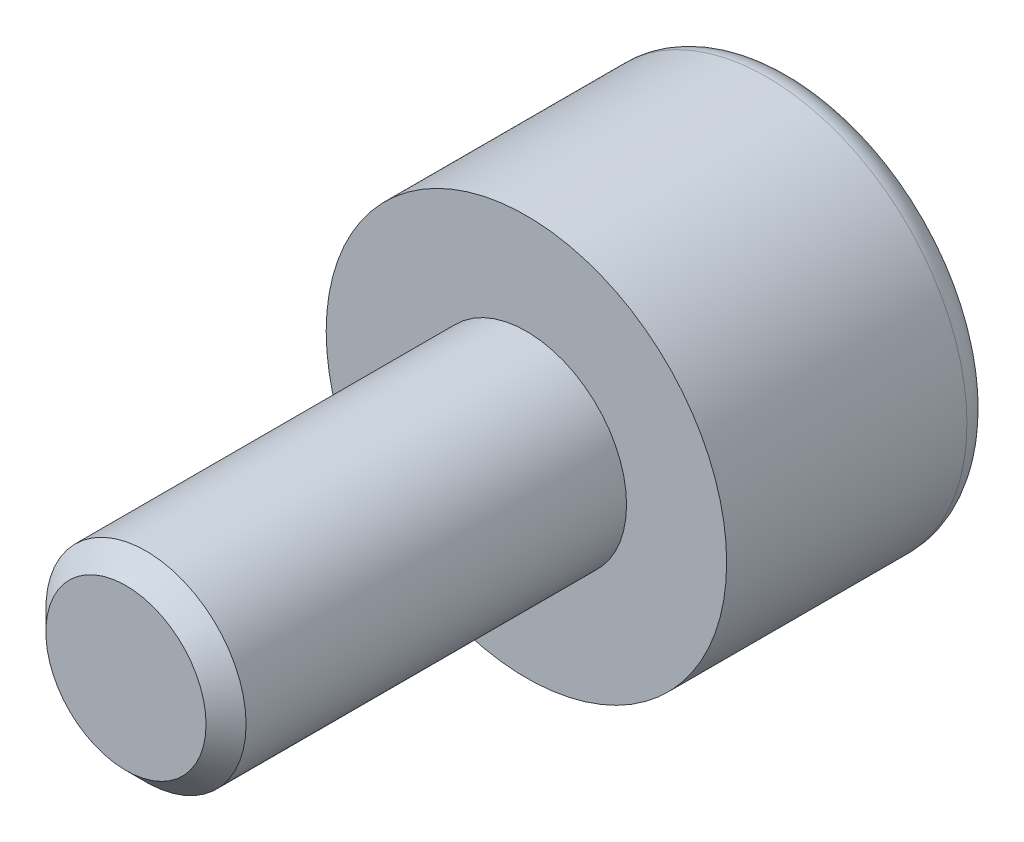
ISO-10303-21;
HEADER;
FILE_DESCRIPTION(('STEP AP214'),'2;1');
FILE_NAME('part.step','',(''),(''),'','','');
FILE_SCHEMA(('AUTOMOTIVE_DESIGN { 1 0 10303 214 1 1 1 1 }'));
ENDSEC;
DATA;
#1=APPLICATION_CONTEXT('core data for automotive mechanical design processes');
#2=APPLICATION_PROTOCOL_DEFINITION('international standard','automotive_design',2000,#1);
#3=PRODUCT_CONTEXT('',#1,'mechanical');
#4=PRODUCT('Part','Part','',(#3));
#5=PRODUCT_RELATED_PRODUCT_CATEGORY('part','',(#4));
#6=PRODUCT_DEFINITION_FORMATION('','',#4);
#7=PRODUCT_DEFINITION_CONTEXT('part definition',#1,'design');
#8=PRODUCT_DEFINITION('design','',#6,#7);
#9=PRODUCT_DEFINITION_SHAPE('','',#8);
#10=(LENGTH_UNIT() NAMED_UNIT(*) SI_UNIT(.MILLI.,.METRE.));
#11=(NAMED_UNIT(*) PLANE_ANGLE_UNIT() SI_UNIT($,.RADIAN.));
#12=(NAMED_UNIT(*) SI_UNIT($,.STERADIAN.) SOLID_ANGLE_UNIT());
#13=UNCERTAINTY_MEASURE_WITH_UNIT(LENGTH_MEASURE(1.E-05),#10,'distance_accuracy_value','');
#14=(GEOMETRIC_REPRESENTATION_CONTEXT(3) GLOBAL_UNCERTAINTY_ASSIGNED_CONTEXT((#13)) GLOBAL_UNIT_ASSIGNED_CONTEXT((#10,
#11,#12)) REPRESENTATION_CONTEXT('',''));
#15=CARTESIAN_POINT('',(0.,0.,0.));
#16=DIRECTION('',(0.,0.,1.));
#17=DIRECTION('',(1.,0.,0.));
#18=AXIS2_PLACEMENT_3D('',#15,#16,#17);
#19=CARTESIAN_POINT('',(0.,0.,-4.));
#20=DIRECTION('',(0.,0.,1.));
#21=DIRECTION('',(1.,0.,0.));
#22=AXIS2_PLACEMENT_3D('',#19,#20,#21);
#23=PLANE('',#22);
#24=CARTESIAN_POINT('',(0.,0.,-4.));
#25=DIRECTION('',(0.,0.,-1.));
#26=DIRECTION('',(-1.,0.,0.));
#27=AXIS2_PLACEMENT_3D('',#24,#25,#26);
#28=CIRCLE('',#27,2.6);
#29=CARTESIAN_POINT('',(-2.6,0.,-4.));
#30=VERTEX_POINT('',#29);
#31=EDGE_CURVE('E149',#30,#30,#28,.T.);
#32=ORIENTED_EDGE('',*,*,#31,.T.);
#33=EDGE_LOOP('',(#32));
#34=FACE_BOUND('',#33,.T.);
#35=DIRECTION('',(-0.86602540378444,0.499999999999998,0.));
#36=VECTOR('',#35,1.);
#37=CARTESIAN_POINT('',(0.,1.73205080756888,-4.));
#38=LINE('',#37,#36);
#39=CARTESIAN_POINT('',(1.5,0.866025403784442,-4.));
#40=VERTEX_POINT('',#39);
#41=CARTESIAN_POINT('',(0.,1.73205080756888,-4.));
#42=VERTEX_POINT('',#41);
#43=EDGE_CURVE('E51',#40,#42,#38,.T.);
#44=ORIENTED_EDGE('',*,*,#43,.T.);
#45=DIRECTION('',(-0.866025403784438,-0.500000000000001,0.));
#46=VECTOR('',#45,1.);
#47=CARTESIAN_POINT('',(0.,1.73205080756888,-4.));
#48=LINE('',#47,#46);
#49=CARTESIAN_POINT('',(-1.5,0.866025403784441,-4.));
#50=VERTEX_POINT('',#49);
#51=EDGE_CURVE('E122',#42,#50,#48,.T.);
#52=ORIENTED_EDGE('',*,*,#51,.T.);
#53=DIRECTION('',(0.,-1.,0.));
#54=VECTOR('',#53,1.);
#55=CARTESIAN_POINT('',(-1.5,-0.866025403784441,-4.));
#56=LINE('',#55,#54);
#57=CARTESIAN_POINT('',(-1.5,-0.866025403784441,-4.));
#58=VERTEX_POINT('',#57);
#59=EDGE_CURVE('E126',#50,#58,#56,.T.);
#60=ORIENTED_EDGE('',*,*,#59,.T.);
#61=DIRECTION('',(0.866025403784438,-0.500000000000001,0.));
#62=VECTOR('',#61,1.);
#63=CARTESIAN_POINT('',(0.,-1.73205080756888,-4.));
#64=LINE('',#63,#62);
#65=CARTESIAN_POINT('',(0.,-1.73205080756888,-4.));
#66=VERTEX_POINT('',#65);
#67=EDGE_CURVE('E129',#58,#66,#64,.T.);
#68=ORIENTED_EDGE('',*,*,#67,.T.);
#69=DIRECTION('',(0.86602540378444,0.499999999999998,0.));
#70=VECTOR('',#69,1.);
#71=CARTESIAN_POINT('',(0.,-1.73205080756888,-4.));
#72=LINE('',#71,#70);
#73=CARTESIAN_POINT('',(1.5,-0.866025403784441,-4.));
#74=VERTEX_POINT('',#73);
#75=EDGE_CURVE('E112',#66,#74,#72,.T.);
#76=ORIENTED_EDGE('',*,*,#75,.T.);
#77=DIRECTION('',(0.,1.,0.));
#78=VECTOR('',#77,1.);
#79=CARTESIAN_POINT('',(1.5,-0.866025403784441,-4.));
#80=LINE('',#79,#78);
#81=EDGE_CURVE('E132',#74,#40,#80,.T.);
#82=ORIENTED_EDGE('',*,*,#81,.T.);
#83=EDGE_LOOP('',(#44,#52,#60,#68,#76,#82));
#84=FACE_BOUND('',#83,.T.);
#85=ADVANCED_FACE('F36',(#34,#84),#23,.F.);
#86=CARTESIAN_POINT('',(0.,0.,-3.6));
#87=DIRECTION('',(0.,0.,-1.));
#88=DIRECTION('',(-1.,0.,0.));
#89=AXIS2_PLACEMENT_3D('',#86,#87,#88);
#90=TOROIDAL_SURFACE('',#89,2.6,0.4);
#91=ORIENTED_EDGE('',*,*,#31,.F.);
#92=EDGE_LOOP('',(#91));
#93=FACE_BOUND('',#92,.T.);
#94=CARTESIAN_POINT('',(0.,0.,-3.6));
#95=DIRECTION('',(0.,0.,-1.));
#96=DIRECTION('',(-1.,0.,0.));
#97=AXIS2_PLACEMENT_3D('',#94,#95,#96);
#98=CIRCLE('',#97,3.);
#99=CARTESIAN_POINT('',(-3.,0.,-3.6));
#100=VERTEX_POINT('',#99);
#101=EDGE_CURVE('E146',#100,#100,#98,.T.);
#102=ORIENTED_EDGE('',*,*,#101,.T.);
#103=EDGE_LOOP('',(#102));
#104=FACE_BOUND('',#103,.T.);
#105=ADVANCED_FACE('F166',(#93,#104),#90,.T.);
#106=CARTESIAN_POINT('',(0.,0.,0.));
#107=DIRECTION('',(0.,0.,-1.));
#108=DIRECTION('',(-1.,0.,0.));
#109=AXIS2_PLACEMENT_3D('',#106,#107,#108);
#110=CYLINDRICAL_SURFACE('',#109,3.);
#111=ORIENTED_EDGE('',*,*,#101,.F.);
#112=EDGE_LOOP('',(#111));
#113=FACE_BOUND('',#112,.T.);
#114=CARTESIAN_POINT('',(0.,0.,0.));
#115=DIRECTION('',(0.,0.,-1.));
#116=DIRECTION('',(-1.,0.,0.));
#117=AXIS2_PLACEMENT_3D('',#114,#115,#116);
#118=CIRCLE('',#117,3.);
#119=CARTESIAN_POINT('',(-3.,0.,0.));
#120=VERTEX_POINT('',#119);
#121=EDGE_CURVE('E143',#120,#120,#118,.T.);
#122=ORIENTED_EDGE('',*,*,#121,.T.);
#123=EDGE_LOOP('',(#122));
#124=FACE_BOUND('',#123,.T.);
#125=ADVANCED_FACE('F171',(#113,#124),#110,.T.);
#126=CARTESIAN_POINT('',(0.,0.,0.));
#127=DIRECTION('',(0.,0.,-1.));
#128=DIRECTION('',(-1.,0.,0.));
#129=AXIS2_PLACEMENT_3D('',#126,#127,#128);
#130=PLANE('',#129);
#131=CARTESIAN_POINT('',(0.,0.,0.));
#132=DIRECTION('',(0.,0.,1.));
#133=DIRECTION('',(1.,0.,0.));
#134=AXIS2_PLACEMENT_3D('',#131,#132,#133);
#135=CIRCLE('',#134,1.5);
#136=CARTESIAN_POINT('',(1.5,0.,0.));
#137=VERTEX_POINT('',#136);
#138=EDGE_CURVE('E123',#137,#137,#135,.T.);
#139=ORIENTED_EDGE('',*,*,#138,.F.);
#140=EDGE_LOOP('',(#139));
#141=FACE_BOUND('',#140,.T.);
#142=ORIENTED_EDGE('',*,*,#121,.F.);
#143=EDGE_LOOP('',(#142));
#144=FACE_BOUND('',#143,.T.);
#145=ADVANCED_FACE('F178',(#141,#144),#130,.F.);
#146=CARTESIAN_POINT('',(0.,1.73205080756888,-2.));
#147=DIRECTION('',(-0.499999999999998,-0.86602540378444,0.));
#148=DIRECTION('',(0.86602540378444,-0.499999999999998,0.));
#149=AXIS2_PLACEMENT_3D('',#146,#147,#148);
#150=PLANE('',#149);
#151=ORIENTED_EDGE('',*,*,#43,.F.);
#152=DIRECTION('',(0.,0.,-1.));
#153=VECTOR('',#152,1.);
#154=CARTESIAN_POINT('',(1.5,0.866025403784442,-2.));
#155=LINE('',#154,#153);
#156=CARTESIAN_POINT('',(1.5,0.866025403784442,-2.));
#157=VERTEX_POINT('',#156);
#158=EDGE_CURVE('E117',#157,#40,#155,.T.);
#159=ORIENTED_EDGE('',*,*,#158,.F.);
#160=DIRECTION('',(-0.86602540378444,0.499999999999998,0.));
#161=VECTOR('',#160,1.);
#162=CARTESIAN_POINT('',(0.,1.73205080756888,-2.));
#163=LINE('',#162,#161);
#164=CARTESIAN_POINT('',(0.,1.73205080756888,-2.));
#165=VERTEX_POINT('',#164);
#166=EDGE_CURVE('E135',#157,#165,#163,.T.);
#167=ORIENTED_EDGE('',*,*,#166,.T.);
#168=DIRECTION('',(0.,0.,-1.));
#169=VECTOR('',#168,1.);
#170=CARTESIAN_POINT('',(0.,1.73205080756888,-2.));
#171=LINE('',#170,#169);
#172=EDGE_CURVE('E141',#165,#42,#171,.T.);
#173=ORIENTED_EDGE('',*,*,#172,.T.);
#174=EDGE_LOOP('',(#151,#159,#167,#173));
#175=FACE_BOUND('',#174,.T.);
#176=ADVANCED_FACE('F182',(#175),#150,.T.);
#177=CARTESIAN_POINT('',(0.,1.73205080756888,-2.));
#178=DIRECTION('',(0.500000000000001,-0.866025403784438,0.));
#179=DIRECTION('',(0.866025403784438,0.500000000000001,0.));
#180=AXIS2_PLACEMENT_3D('',#177,#178,#179);
#181=PLANE('',#180);
#182=ORIENTED_EDGE('',*,*,#51,.F.);
#183=ORIENTED_EDGE('',*,*,#172,.F.);
#184=DIRECTION('',(-0.866025403784438,-0.500000000000001,0.));
#185=VECTOR('',#184,1.);
#186=CARTESIAN_POINT('',(0.,1.73205080756888,-2.));
#187=LINE('',#186,#185);
#188=CARTESIAN_POINT('',(-1.5,0.866025403784441,-2.));
#189=VERTEX_POINT('',#188);
#190=EDGE_CURVE('E90',#165,#189,#187,.T.);
#191=ORIENTED_EDGE('',*,*,#190,.T.);
#192=DIRECTION('',(0.,0.,-1.));
#193=VECTOR('',#192,1.);
#194=CARTESIAN_POINT('',(-1.5,0.866025403784441,-2.));
#195=LINE('',#194,#193);
#196=EDGE_CURVE('E139',#189,#50,#195,.T.);
#197=ORIENTED_EDGE('',*,*,#196,.T.);
#198=EDGE_LOOP('',(#182,#183,#191,#197));
#199=FACE_BOUND('',#198,.T.);
#200=ADVANCED_FACE('F186',(#199),#181,.T.);
#201=CARTESIAN_POINT('',(-1.5,-0.866025403784441,-2.));
#202=DIRECTION('',(1.,0.,0.));
#203=DIRECTION('',(0.,0.,-1.));
#204=AXIS2_PLACEMENT_3D('',#201,#202,#203);
#205=PLANE('',#204);
#206=ORIENTED_EDGE('',*,*,#59,.F.);
#207=ORIENTED_EDGE('',*,*,#196,.F.);
#208=DIRECTION('',(0.,-1.,0.));
#209=VECTOR('',#208,1.);
#210=CARTESIAN_POINT('',(-1.5,-0.866025403784441,-2.));
#211=LINE('',#210,#209);
#212=CARTESIAN_POINT('',(-1.5,-0.866025403784441,-2.));
#213=VERTEX_POINT('',#212);
#214=EDGE_CURVE('E108',#189,#213,#211,.T.);
#215=ORIENTED_EDGE('',*,*,#214,.T.);
#216=DIRECTION('',(0.,0.,-1.));
#217=VECTOR('',#216,1.);
#218=CARTESIAN_POINT('',(-1.5,-0.866025403784441,-2.));
#219=LINE('',#218,#217);
#220=EDGE_CURVE('E105',#213,#58,#219,.T.);
#221=ORIENTED_EDGE('',*,*,#220,.T.);
#222=EDGE_LOOP('',(#206,#207,#215,#221));
#223=FACE_BOUND('',#222,.T.);
#224=ADVANCED_FACE('F189',(#223),#205,.T.);
#225=CARTESIAN_POINT('',(0.,-1.73205080756888,-2.));
#226=DIRECTION('',(0.500000000000001,0.866025403784438,0.));
#227=DIRECTION('',(-0.866025403784438,0.500000000000001,0.));
#228=AXIS2_PLACEMENT_3D('',#225,#226,#227);
#229=PLANE('',#228);
#230=ORIENTED_EDGE('',*,*,#67,.F.);
#231=ORIENTED_EDGE('',*,*,#220,.F.);
#232=DIRECTION('',(0.866025403784438,-0.500000000000001,0.));
#233=VECTOR('',#232,1.);
#234=CARTESIAN_POINT('',(0.,-1.73205080756888,-2.));
#235=LINE('',#234,#233);
#236=CARTESIAN_POINT('',(0.,-1.73205080756888,-2.));
#237=VERTEX_POINT('',#236);
#238=EDGE_CURVE('E100',#213,#237,#235,.T.);
#239=ORIENTED_EDGE('',*,*,#238,.T.);
#240=DIRECTION('',(0.,0.,-1.));
#241=VECTOR('',#240,1.);
#242=CARTESIAN_POINT('',(0.,-1.73205080756888,-2.));
#243=LINE('',#242,#241);
#244=EDGE_CURVE('E104',#237,#66,#243,.T.);
#245=ORIENTED_EDGE('',*,*,#244,.T.);
#246=EDGE_LOOP('',(#230,#231,#239,#245));
#247=FACE_BOUND('',#246,.T.);
#248=ADVANCED_FACE('F103',(#247),#229,.T.);
#249=CARTESIAN_POINT('',(0.,-1.73205080756888,-2.));
#250=DIRECTION('',(-0.499999999999998,0.86602540378444,0.));
#251=DIRECTION('',(-0.86602540378444,-0.499999999999998,0.));
#252=AXIS2_PLACEMENT_3D('',#249,#250,#251);
#253=PLANE('',#252);
#254=ORIENTED_EDGE('',*,*,#75,.F.);
#255=ORIENTED_EDGE('',*,*,#244,.F.);
#256=DIRECTION('',(0.86602540378444,0.499999999999998,0.));
#257=VECTOR('',#256,1.);
#258=CARTESIAN_POINT('',(0.,-1.73205080756888,-2.));
#259=LINE('',#258,#257);
#260=CARTESIAN_POINT('',(1.5,-0.866025403784441,-2.));
#261=VERTEX_POINT('',#260);
#262=EDGE_CURVE('E107',#237,#261,#259,.T.);
#263=ORIENTED_EDGE('',*,*,#262,.T.);
#264=DIRECTION('',(0.,0.,-1.));
#265=VECTOR('',#264,1.);
#266=CARTESIAN_POINT('',(1.5,-0.866025403784441,-2.));
#267=LINE('',#266,#265);
#268=EDGE_CURVE('E81',#261,#74,#267,.T.);
#269=ORIENTED_EDGE('',*,*,#268,.T.);
#270=EDGE_LOOP('',(#254,#255,#263,#269));
#271=FACE_BOUND('',#270,.T.);
#272=ADVANCED_FACE('F110',(#271),#253,.T.);
#273=CARTESIAN_POINT('',(1.5,-0.866025403784441,-2.));
#274=DIRECTION('',(-1.,0.,0.));
#275=DIRECTION('',(0.,0.,1.));
#276=AXIS2_PLACEMENT_3D('',#273,#274,#275);
#277=PLANE('',#276);
#278=ORIENTED_EDGE('',*,*,#81,.F.);
#279=ORIENTED_EDGE('',*,*,#268,.F.);
#280=DIRECTION('',(0.,1.,0.));
#281=VECTOR('',#280,1.);
#282=CARTESIAN_POINT('',(1.5,-0.866025403784441,-2.));
#283=LINE('',#282,#281);
#284=EDGE_CURVE('E59',#261,#157,#283,.T.);
#285=ORIENTED_EDGE('',*,*,#284,.T.);
#286=ORIENTED_EDGE('',*,*,#158,.T.);
#287=EDGE_LOOP('',(#278,#279,#285,#286));
#288=FACE_BOUND('',#287,.T.);
#289=ADVANCED_FACE('F198',(#288),#277,.T.);
#290=CARTESIAN_POINT('',(1.5,0.866025403784442,-2.));
#291=DIRECTION('',(0.,0.,1.));
#292=DIRECTION('',(1.,0.,0.));
#293=AXIS2_PLACEMENT_3D('',#290,#291,#292);
#294=PLANE('',#293);
#295=ORIENTED_EDGE('',*,*,#166,.F.);
#296=ORIENTED_EDGE('',*,*,#284,.F.);
#297=ORIENTED_EDGE('',*,*,#262,.F.);
#298=ORIENTED_EDGE('',*,*,#238,.F.);
#299=ORIENTED_EDGE('',*,*,#214,.F.);
#300=ORIENTED_EDGE('',*,*,#190,.F.);
#301=EDGE_LOOP('',(#295,#296,#297,#298,#299,#300));
#302=FACE_BOUND('',#301,.T.);
#303=ADVANCED_FACE('F115',(#302),#294,.F.);
#304=CARTESIAN_POINT('',(0.,0.,6.));
#305=DIRECTION('',(0.,0.,1.));
#306=DIRECTION('',(1.,0.,0.));
#307=AXIS2_PLACEMENT_3D('',#304,#305,#306);
#308=PLANE('',#307);
#309=CARTESIAN_POINT('',(0.,0.,6.));
#310=DIRECTION('',(0.,0.,1.));
#311=DIRECTION('',(1.,0.,0.));
#312=AXIS2_PLACEMENT_3D('',#309,#310,#311);
#313=CIRCLE('',#312,1.2);
#314=CARTESIAN_POINT('',(1.2,0.,6.));
#315=VERTEX_POINT('',#314);
#316=EDGE_CURVE('E44',#315,#315,#313,.T.);
#317=ORIENTED_EDGE('',*,*,#316,.T.);
#318=EDGE_LOOP('',(#317));
#319=FACE_BOUND('',#318,.T.);
#320=ADVANCED_FACE('F154',(#319),#308,.T.);
#321=CARTESIAN_POINT('',(0.,0.,0.));
#322=DIRECTION('',(0.,0.,1.));
#323=DIRECTION('',(1.,0.,0.));
#324=AXIS2_PLACEMENT_3D('',#321,#322,#323);
#325=CYLINDRICAL_SURFACE('',#324,1.5);
#326=CARTESIAN_POINT('',(0.,0.,5.7));
#327=DIRECTION('',(0.,0.,1.));
#328=DIRECTION('',(1.,0.,0.));
#329=AXIS2_PLACEMENT_3D('',#326,#327,#328);
#330=CIRCLE('',#329,1.5);
#331=CARTESIAN_POINT('',(1.5,0.,5.7));
#332=VERTEX_POINT('',#331);
#333=EDGE_CURVE('E11',#332,#332,#330,.F.);
#334=ORIENTED_EDGE('',*,*,#333,.T.);
#335=EDGE_LOOP('',(#334));
#336=FACE_BOUND('',#335,.T.);
#337=ORIENTED_EDGE('',*,*,#138,.T.);
#338=EDGE_LOOP('',(#337));
#339=FACE_BOUND('',#338,.T.);
#340=ADVANCED_FACE('F157',(#336,#339),#325,.T.);
#341=CARTESIAN_POINT('',(0.,0.,6.));
#342=DIRECTION('',(0.,0.,-1.));
#343=DIRECTION('',(-1.,0.,0.));
#344=AXIS2_PLACEMENT_3D('',#341,#342,#343);
#345=CONICAL_SURFACE('',#344,1.2,0.785398163397447);
#346=ORIENTED_EDGE('',*,*,#333,.F.);
#347=EDGE_LOOP('',(#346));
#348=FACE_BOUND('',#347,.T.);
#349=ORIENTED_EDGE('',*,*,#316,.F.);
#350=EDGE_LOOP('',(#349));
#351=FACE_BOUND('',#350,.T.);
#352=ADVANCED_FACE('F38',(#348,#351),#345,.T.);
#353=CLOSED_SHELL('',(#85,#105,#125,#145,#176,#200,#224,#248,#272,#289,#303,#320,#340,#352));
#354=MANIFOLD_SOLID_BREP('B2',#353);
#355=ADVANCED_BREP_SHAPE_REPRESENTATION('',(#18,#354),#14);
#356=SHAPE_DEFINITION_REPRESENTATION(#9,#355);
ENDSEC;
END-ISO-10303-21;
